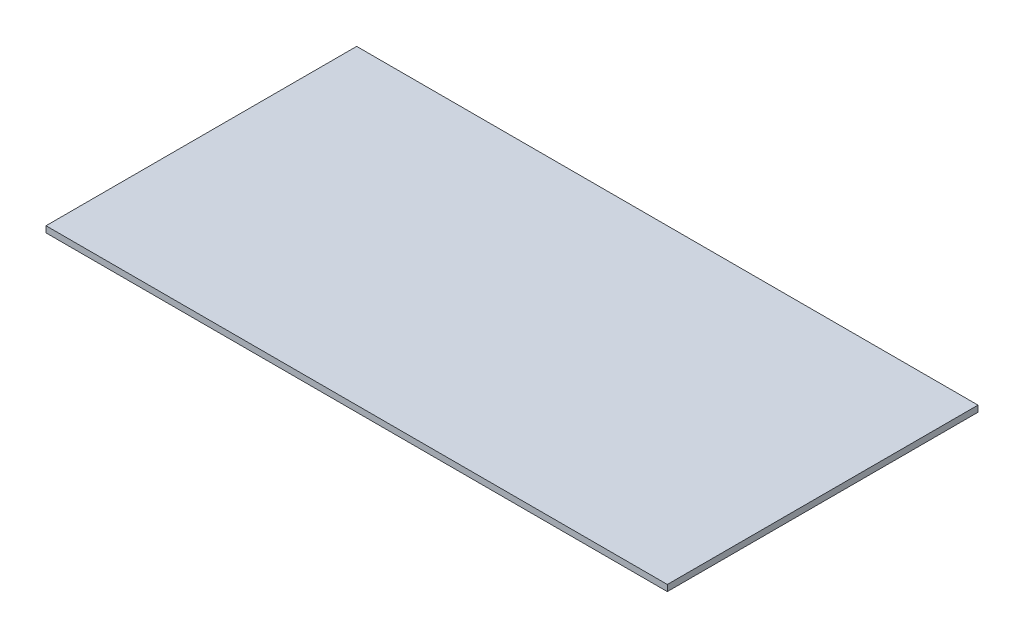
ISO-10303-21;
HEADER;
FILE_DESCRIPTION(('STEP AP214'),'2;1');
FILE_NAME('part.step','',(''),(''),'','','');
FILE_SCHEMA(('AUTOMOTIVE_DESIGN { 1 0 10303 214 1 1 1 1 }'));
ENDSEC;
DATA;
#1=APPLICATION_CONTEXT('core data for automotive mechanical design processes');
#2=APPLICATION_PROTOCOL_DEFINITION('international standard','automotive_design',2000,#1);
#3=PRODUCT_CONTEXT('',#1,'mechanical');
#4=PRODUCT('Part','Part','',(#3));
#5=PRODUCT_RELATED_PRODUCT_CATEGORY('part','',(#4));
#6=PRODUCT_DEFINITION_FORMATION('','',#4);
#7=PRODUCT_DEFINITION_CONTEXT('part definition',#1,'design');
#8=PRODUCT_DEFINITION('design','',#6,#7);
#9=PRODUCT_DEFINITION_SHAPE('','',#8);
#10=(LENGTH_UNIT() NAMED_UNIT(*) SI_UNIT(.MILLI.,.METRE.));
#11=(NAMED_UNIT(*) PLANE_ANGLE_UNIT() SI_UNIT($,.RADIAN.));
#12=(NAMED_UNIT(*) SI_UNIT($,.STERADIAN.) SOLID_ANGLE_UNIT());
#13=UNCERTAINTY_MEASURE_WITH_UNIT(LENGTH_MEASURE(1.E-05),#10,'distance_accuracy_value','');
#14=(GEOMETRIC_REPRESENTATION_CONTEXT(3) GLOBAL_UNCERTAINTY_ASSIGNED_CONTEXT((#13)) GLOBAL_UNIT_ASSIGNED_CONTEXT((#10,
#11,#12)) REPRESENTATION_CONTEXT('',''));
#15=CARTESIAN_POINT('',(0.,0.,0.));
#16=DIRECTION('',(0.,0.,1.));
#17=DIRECTION('',(1.,0.,0.));
#18=AXIS2_PLACEMENT_3D('',#15,#16,#17);
#19=CARTESIAN_POINT('',(158.75,3.175,79.375));
#20=DIRECTION('',(-1.,0.,0.));
#21=DIRECTION('',(0.,0.,1.));
#22=AXIS2_PLACEMENT_3D('',#19,#20,#21);
#23=PLANE('',#22);
#24=DIRECTION('',(0.,0.,-1.));
#25=VECTOR('',#24,1.);
#26=CARTESIAN_POINT('',(158.75,0.,79.375));
#27=LINE('',#26,#25);
#28=CARTESIAN_POINT('',(158.75,0.,79.375));
#29=VERTEX_POINT('',#28);
#30=CARTESIAN_POINT('',(158.75,0.,-79.375));
#31=VERTEX_POINT('',#30);
#32=EDGE_CURVE('E102',#29,#31,#27,.T.);
#33=ORIENTED_EDGE('',*,*,#32,.T.);
#34=DIRECTION('',(0.,-1.,0.));
#35=VECTOR('',#34,1.);
#36=CARTESIAN_POINT('',(158.75,3.175,-79.375));
#37=LINE('',#36,#35);
#38=CARTESIAN_POINT('',(158.75,3.175,-79.375));
#39=VERTEX_POINT('',#38);
#40=EDGE_CURVE('E11',#39,#31,#37,.T.);
#41=ORIENTED_EDGE('',*,*,#40,.F.);
#42=DIRECTION('',(0.,0.,-1.));
#43=VECTOR('',#42,1.);
#44=CARTESIAN_POINT('',(158.75,3.175,79.375));
#45=LINE('',#44,#43);
#46=CARTESIAN_POINT('',(158.75,3.175,79.375));
#47=VERTEX_POINT('',#46);
#48=EDGE_CURVE('E90',#47,#39,#45,.T.);
#49=ORIENTED_EDGE('',*,*,#48,.F.);
#50=DIRECTION('',(0.,-1.,0.));
#51=VECTOR('',#50,1.);
#52=CARTESIAN_POINT('',(158.75,3.175,79.375));
#53=LINE('',#52,#51);
#54=EDGE_CURVE('E98',#47,#29,#53,.T.);
#55=ORIENTED_EDGE('',*,*,#54,.T.);
#56=EDGE_LOOP('',(#33,#41,#49,#55));
#57=FACE_BOUND('',#56,.T.);
#58=ADVANCED_FACE('F39',(#57),#23,.F.);
#59=CARTESIAN_POINT('',(-158.75,3.175,-79.375));
#60=DIRECTION('',(0.,0.,1.));
#61=DIRECTION('',(1.,0.,0.));
#62=AXIS2_PLACEMENT_3D('',#59,#60,#61);
#63=PLANE('',#62);
#64=DIRECTION('',(-1.,0.,0.));
#65=VECTOR('',#64,1.);
#66=CARTESIAN_POINT('',(-158.75,0.,-79.375));
#67=LINE('',#66,#65);
#68=CARTESIAN_POINT('',(-158.75,0.,-79.375));
#69=VERTEX_POINT('',#68);
#70=EDGE_CURVE('E94',#31,#69,#67,.T.);
#71=ORIENTED_EDGE('',*,*,#70,.T.);
#72=DIRECTION('',(0.,-1.,0.));
#73=VECTOR('',#72,1.);
#74=CARTESIAN_POINT('',(-158.75,3.175,-79.375));
#75=LINE('',#74,#73);
#76=CARTESIAN_POINT('',(-158.75,3.175,-79.375));
#77=VERTEX_POINT('',#76);
#78=EDGE_CURVE('E47',#77,#69,#75,.T.);
#79=ORIENTED_EDGE('',*,*,#78,.F.);
#80=DIRECTION('',(-1.,0.,0.));
#81=VECTOR('',#80,1.);
#82=CARTESIAN_POINT('',(-158.75,3.175,-79.375));
#83=LINE('',#82,#81);
#84=EDGE_CURVE('E85',#39,#77,#83,.T.);
#85=ORIENTED_EDGE('',*,*,#84,.F.);
#86=ORIENTED_EDGE('',*,*,#40,.T.);
#87=EDGE_LOOP('',(#71,#79,#85,#86));
#88=FACE_BOUND('',#87,.T.);
#89=ADVANCED_FACE('F93',(#88),#63,.F.);
#90=CARTESIAN_POINT('',(-158.75,3.175,79.375));
#91=DIRECTION('',(1.,0.,0.));
#92=DIRECTION('',(0.,0.,-1.));
#93=AXIS2_PLACEMENT_3D('',#90,#91,#92);
#94=PLANE('',#93);
#95=DIRECTION('',(0.,0.,1.));
#96=VECTOR('',#95,1.);
#97=CARTESIAN_POINT('',(-158.75,0.,79.375));
#98=LINE('',#97,#96);
#99=CARTESIAN_POINT('',(-158.75,0.,79.375));
#100=VERTEX_POINT('',#99);
#101=EDGE_CURVE('E72',#69,#100,#98,.T.);
#102=ORIENTED_EDGE('',*,*,#101,.T.);
#103=DIRECTION('',(0.,-1.,0.));
#104=VECTOR('',#103,1.);
#105=CARTESIAN_POINT('',(-158.75,3.175,79.375));
#106=LINE('',#105,#104);
#107=CARTESIAN_POINT('',(-158.75,3.175,79.375));
#108=VERTEX_POINT('',#107);
#109=EDGE_CURVE('E95',#108,#100,#106,.T.);
#110=ORIENTED_EDGE('',*,*,#109,.F.);
#111=DIRECTION('',(0.,0.,1.));
#112=VECTOR('',#111,1.);
#113=CARTESIAN_POINT('',(-158.75,3.175,79.375));
#114=LINE('',#113,#112);
#115=EDGE_CURVE('E88',#77,#108,#114,.T.);
#116=ORIENTED_EDGE('',*,*,#115,.F.);
#117=ORIENTED_EDGE('',*,*,#78,.T.);
#118=EDGE_LOOP('',(#102,#110,#116,#117));
#119=FACE_BOUND('',#118,.T.);
#120=ADVANCED_FACE('F96',(#119),#94,.F.);
#121=CARTESIAN_POINT('',(-158.75,3.175,79.375));
#122=DIRECTION('',(0.,0.,-1.));
#123=DIRECTION('',(-1.,0.,0.));
#124=AXIS2_PLACEMENT_3D('',#121,#122,#123);
#125=PLANE('',#124);
#126=DIRECTION('',(1.,0.,0.));
#127=VECTOR('',#126,1.);
#128=CARTESIAN_POINT('',(-158.75,0.,79.375));
#129=LINE('',#128,#127);
#130=EDGE_CURVE('E78',#100,#29,#129,.T.);
#131=ORIENTED_EDGE('',*,*,#130,.T.);
#132=ORIENTED_EDGE('',*,*,#54,.F.);
#133=DIRECTION('',(1.,0.,0.));
#134=VECTOR('',#133,1.);
#135=CARTESIAN_POINT('',(-158.75,3.175,79.375));
#136=LINE('',#135,#134);
#137=EDGE_CURVE('E55',#108,#47,#136,.T.);
#138=ORIENTED_EDGE('',*,*,#137,.F.);
#139=ORIENTED_EDGE('',*,*,#109,.T.);
#140=EDGE_LOOP('',(#131,#132,#138,#139));
#141=FACE_BOUND('',#140,.T.);
#142=ADVANCED_FACE('F109',(#141),#125,.F.);
#143=CARTESIAN_POINT('',(0.,3.175,0.));
#144=DIRECTION('',(0.,-1.,0.));
#145=DIRECTION('',(0.,0.,-1.));
#146=AXIS2_PLACEMENT_3D('',#143,#144,#145);
#147=PLANE('',#146);
#148=ORIENTED_EDGE('',*,*,#48,.T.);
#149=ORIENTED_EDGE('',*,*,#84,.T.);
#150=ORIENTED_EDGE('',*,*,#115,.T.);
#151=ORIENTED_EDGE('',*,*,#137,.T.);
#152=EDGE_LOOP('',(#148,#149,#150,#151));
#153=FACE_BOUND('',#152,.T.);
#154=ADVANCED_FACE('F86',(#153),#147,.F.);
#155=CARTESIAN_POINT('',(0.,0.,0.));
#156=DIRECTION('',(0.,-1.,0.));
#157=DIRECTION('',(0.,0.,-1.));
#158=AXIS2_PLACEMENT_3D('',#155,#156,#157);
#159=PLANE('',#158);
#160=ORIENTED_EDGE('',*,*,#32,.F.);
#161=ORIENTED_EDGE('',*,*,#130,.F.);
#162=ORIENTED_EDGE('',*,*,#101,.F.);
#163=ORIENTED_EDGE('',*,*,#70,.F.);
#164=EDGE_LOOP('',(#160,#161,#162,#163));
#165=FACE_BOUND('',#164,.T.);
#166=ADVANCED_FACE('F112',(#165),#159,.T.);
#167=CLOSED_SHELL('',(#58,#89,#120,#142,#154,#166));
#168=MANIFOLD_SOLID_BREP('B2',#167);
#169=ADVANCED_BREP_SHAPE_REPRESENTATION('',(#18,#168),#14);
#170=SHAPE_DEFINITION_REPRESENTATION(#9,#169);
ENDSEC;
END-ISO-10303-21;
